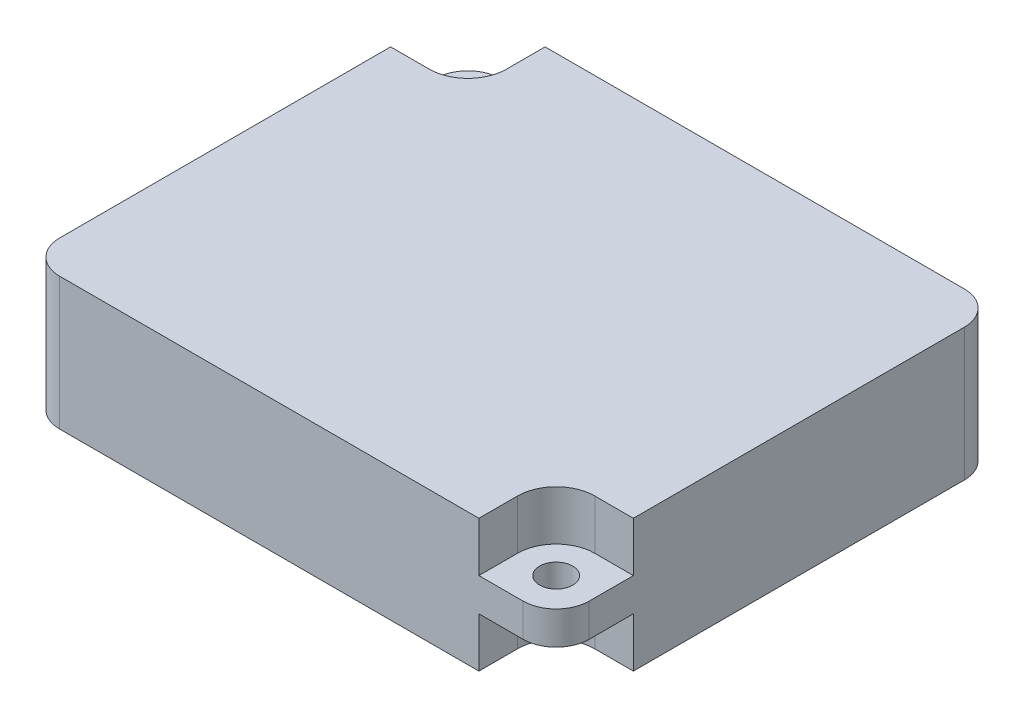
ISO-10303-21;
HEADER;
FILE_DESCRIPTION(('STEP AP214'),'2;1');
FILE_NAME('part.step','',(''),(''),'','','');
FILE_SCHEMA(('AUTOMOTIVE_DESIGN { 1 0 10303 214 1 1 1 1 }'));
ENDSEC;
DATA;
#1=APPLICATION_CONTEXT('core data for automotive mechanical design processes');
#2=APPLICATION_PROTOCOL_DEFINITION('international standard','automotive_design',2000,#1);
#3=PRODUCT_CONTEXT('',#1,'mechanical');
#4=PRODUCT('Part','Part','',(#3));
#5=PRODUCT_RELATED_PRODUCT_CATEGORY('part','',(#4));
#6=PRODUCT_DEFINITION_FORMATION('','',#4);
#7=PRODUCT_DEFINITION_CONTEXT('part definition',#1,'design');
#8=PRODUCT_DEFINITION('design','',#6,#7);
#9=PRODUCT_DEFINITION_SHAPE('','',#8);
#10=(LENGTH_UNIT() NAMED_UNIT(*) SI_UNIT(.MILLI.,.METRE.));
#11=(NAMED_UNIT(*) PLANE_ANGLE_UNIT() SI_UNIT($,.RADIAN.));
#12=(NAMED_UNIT(*) SI_UNIT($,.STERADIAN.) SOLID_ANGLE_UNIT());
#13=UNCERTAINTY_MEASURE_WITH_UNIT(LENGTH_MEASURE(1.E-05),#10,'distance_accuracy_value','');
#14=(GEOMETRIC_REPRESENTATION_CONTEXT(3) GLOBAL_UNCERTAINTY_ASSIGNED_CONTEXT((#13)) GLOBAL_UNIT_ASSIGNED_CONTEXT((#10,
#11,#12)) REPRESENTATION_CONTEXT('',''));
#15=CARTESIAN_POINT('',(0.,0.,0.));
#16=DIRECTION('',(0.,0.,1.));
#17=DIRECTION('',(1.,0.,0.));
#18=AXIS2_PLACEMENT_3D('',#15,#16,#17);
#19=CARTESIAN_POINT('',(-17.,-6.,-16.5));
#20=DIRECTION('',(1.,0.,0.));
#21=DIRECTION('',(0.,0.,-1.));
#22=AXIS2_PLACEMENT_3D('',#19,#20,#21);
#23=PLANE('',#22);
#24=DIRECTION('',(0.,0.,-1.));
#25=VECTOR('',#24,1.);
#26=CARTESIAN_POINT('',(-17.,-1.5,-16.5));
#27=LINE('',#26,#25);
#28=CARTESIAN_POINT('',(-17.,-1.5,-16.5));
#29=VERTEX_POINT('',#28);
#30=CARTESIAN_POINT('',(-17.,-1.5,-20.));
#31=VERTEX_POINT('',#30);
#32=EDGE_CURVE('E235',#29,#31,#27,.T.);
#33=ORIENTED_EDGE('',*,*,#32,.T.);
#34=DIRECTION('',(0.,1.,0.));
#35=VECTOR('',#34,1.);
#36=CARTESIAN_POINT('',(-17.,-6.,-20.));
#37=LINE('',#36,#35);
#38=CARTESIAN_POINT('',(-17.,-6.,-20.));
#39=VERTEX_POINT('',#38);
#40=EDGE_CURVE('E278',#39,#31,#37,.T.);
#41=ORIENTED_EDGE('',*,*,#40,.F.);
#42=DIRECTION('',(0.,0.,-1.));
#43=VECTOR('',#42,1.);
#44=CARTESIAN_POINT('',(-17.,-6.,-16.5));
#45=LINE('',#44,#43);
#46=CARTESIAN_POINT('',(-17.,-6.,-16.5));
#47=VERTEX_POINT('',#46);
#48=EDGE_CURVE('E211',#47,#39,#45,.T.);
#49=ORIENTED_EDGE('',*,*,#48,.F.);
#50=DIRECTION('',(0.,1.,0.));
#51=VECTOR('',#50,1.);
#52=CARTESIAN_POINT('',(-17.,-6.,-16.5));
#53=LINE('',#52,#51);
#54=EDGE_CURVE('E288',#47,#29,#53,.T.);
#55=ORIENTED_EDGE('',*,*,#54,.T.);
#56=EDGE_LOOP('',(#33,#41,#49,#55));
#57=FACE_BOUND('',#56,.T.);
#58=ADVANCED_FACE('F33',(#57),#23,.F.);
#59=CARTESIAN_POINT('',(-20.5,-6.,-16.5));
#60=DIRECTION('',(0.,1.,0.));
#61=DIRECTION('',(0.,0.,1.));
#62=AXIS2_PLACEMENT_3D('',#59,#60,#61);
#63=CYLINDRICAL_SURFACE('',#62,3.5);
#64=CARTESIAN_POINT('',(-20.5,-1.5,-16.5));
#65=DIRECTION('',(0.,1.,0.));
#66=DIRECTION('',(0.,0.,1.));
#67=AXIS2_PLACEMENT_3D('',#64,#65,#66);
#68=CIRCLE('',#67,3.5);
#69=CARTESIAN_POINT('',(-20.5,-1.5,-13.));
#70=VERTEX_POINT('',#69);
#71=EDGE_CURVE('E233',#70,#29,#68,.T.);
#72=ORIENTED_EDGE('',*,*,#71,.T.);
#73=ORIENTED_EDGE('',*,*,#54,.F.);
#74=CARTESIAN_POINT('',(-20.5,-6.,-16.5));
#75=DIRECTION('',(0.,1.,0.));
#76=DIRECTION('',(0.,0.,1.));
#77=AXIS2_PLACEMENT_3D('',#74,#75,#76);
#78=CIRCLE('',#77,3.5);
#79=CARTESIAN_POINT('',(-20.5,-6.,-13.));
#80=VERTEX_POINT('',#79);
#81=EDGE_CURVE('E272',#80,#47,#78,.T.);
#82=ORIENTED_EDGE('',*,*,#81,.F.);
#83=DIRECTION('',(0.,1.,0.));
#84=VECTOR('',#83,1.);
#85=CARTESIAN_POINT('',(-20.5,-6.,-13.));
#86=LINE('',#85,#84);
#87=EDGE_CURVE('E284',#80,#70,#86,.T.);
#88=ORIENTED_EDGE('',*,*,#87,.T.);
#89=EDGE_LOOP('',(#72,#73,#82,#88));
#90=FACE_BOUND('',#89,.T.);
#91=ADVANCED_FACE('F396',(#90),#63,.F.);
#92=CARTESIAN_POINT('',(-24.,-6.,-13.));
#93=DIRECTION('',(0.,0.,1.));
#94=DIRECTION('',(1.,0.,0.));
#95=AXIS2_PLACEMENT_3D('',#92,#93,#94);
#96=PLANE('',#95);
#97=DIRECTION('',(1.,0.,0.));
#98=VECTOR('',#97,1.);
#99=CARTESIAN_POINT('',(-24.,-1.5,-13.));
#100=LINE('',#99,#98);
#101=CARTESIAN_POINT('',(-24.,-1.5,-13.));
#102=VERTEX_POINT('',#101);
#103=EDGE_CURVE('E231',#102,#70,#100,.T.);
#104=ORIENTED_EDGE('',*,*,#103,.T.);
#105=ORIENTED_EDGE('',*,*,#87,.F.);
#106=DIRECTION('',(1.,0.,0.));
#107=VECTOR('',#106,1.);
#108=CARTESIAN_POINT('',(-24.,-6.,-13.));
#109=LINE('',#108,#107);
#110=CARTESIAN_POINT('',(-24.,-6.,-13.));
#111=VERTEX_POINT('',#110);
#112=EDGE_CURVE('E269',#111,#80,#109,.T.);
#113=ORIENTED_EDGE('',*,*,#112,.F.);
#114=DIRECTION('',(0.,1.,0.));
#115=VECTOR('',#114,1.);
#116=CARTESIAN_POINT('',(-24.,-6.,-13.));
#117=LINE('',#116,#115);
#118=EDGE_CURVE('E210',#111,#102,#117,.T.);
#119=ORIENTED_EDGE('',*,*,#118,.T.);
#120=EDGE_LOOP('',(#104,#105,#113,#119));
#121=FACE_BOUND('',#120,.T.);
#122=ADVANCED_FACE('F392',(#121),#96,.F.);
#123=CARTESIAN_POINT('',(20.5,-6.,16.5));
#124=DIRECTION('',(0.,1.,0.));
#125=DIRECTION('',(0.,0.,1.));
#126=AXIS2_PLACEMENT_3D('',#123,#124,#125);
#127=CYLINDRICAL_SURFACE('',#126,3.5);
#128=CARTESIAN_POINT('',(20.5,-1.5,16.5));
#129=DIRECTION('',(0.,1.,0.));
#130=DIRECTION('',(0.,0.,1.));
#131=AXIS2_PLACEMENT_3D('',#128,#129,#130);
#132=CIRCLE('',#131,3.5);
#133=CARTESIAN_POINT('',(20.5,-1.5,13.));
#134=VERTEX_POINT('',#133);
#135=CARTESIAN_POINT('',(17.,-1.5,16.5));
#136=VERTEX_POINT('',#135);
#137=EDGE_CURVE('E261',#134,#136,#132,.T.);
#138=ORIENTED_EDGE('',*,*,#137,.T.);
#139=DIRECTION('',(0.,1.,0.));
#140=VECTOR('',#139,1.);
#141=CARTESIAN_POINT('',(17.,-6.,16.5));
#142=LINE('',#141,#140);
#143=CARTESIAN_POINT('',(17.,-6.,16.5));
#144=VERTEX_POINT('',#143);
#145=EDGE_CURVE('E311',#144,#136,#142,.T.);
#146=ORIENTED_EDGE('',*,*,#145,.F.);
#147=CARTESIAN_POINT('',(20.5,-6.,16.5));
#148=DIRECTION('',(0.,1.,0.));
#149=DIRECTION('',(0.,0.,1.));
#150=AXIS2_PLACEMENT_3D('',#147,#148,#149);
#151=CIRCLE('',#150,3.5);
#152=CARTESIAN_POINT('',(20.5,-6.,13.));
#153=VERTEX_POINT('',#152);
#154=EDGE_CURVE('E256',#153,#144,#151,.T.);
#155=ORIENTED_EDGE('',*,*,#154,.F.);
#156=DIRECTION('',(0.,1.,0.));
#157=VECTOR('',#156,1.);
#158=CARTESIAN_POINT('',(20.5,-6.,13.));
#159=LINE('',#158,#157);
#160=EDGE_CURVE('E273',#153,#134,#159,.T.);
#161=ORIENTED_EDGE('',*,*,#160,.T.);
#162=EDGE_LOOP('',(#138,#146,#155,#161));
#163=FACE_BOUND('',#162,.T.);
#164=ADVANCED_FACE('F450',(#163),#127,.F.);
#165=CARTESIAN_POINT('',(24.,-6.,13.));
#166=DIRECTION('',(0.,0.,-1.));
#167=DIRECTION('',(-1.,0.,0.));
#168=AXIS2_PLACEMENT_3D('',#165,#166,#167);
#169=PLANE('',#168);
#170=DIRECTION('',(-1.,0.,0.));
#171=VECTOR('',#170,1.);
#172=CARTESIAN_POINT('',(24.,-1.5,13.));
#173=LINE('',#172,#171);
#174=CARTESIAN_POINT('',(24.,-1.5,13.));
#175=VERTEX_POINT('',#174);
#176=EDGE_CURVE('E258',#175,#134,#173,.T.);
#177=ORIENTED_EDGE('',*,*,#176,.T.);
#178=ORIENTED_EDGE('',*,*,#160,.F.);
#179=DIRECTION('',(-1.,0.,0.));
#180=VECTOR('',#179,1.);
#181=CARTESIAN_POINT('',(24.,-6.,13.));
#182=LINE('',#181,#180);
#183=CARTESIAN_POINT('',(24.,-6.,13.));
#184=VERTEX_POINT('',#183);
#185=EDGE_CURVE('E296',#184,#153,#182,.T.);
#186=ORIENTED_EDGE('',*,*,#185,.F.);
#187=DIRECTION('',(0.,1.,0.));
#188=VECTOR('',#187,1.);
#189=CARTESIAN_POINT('',(24.,-6.,13.));
#190=LINE('',#189,#188);
#191=EDGE_CURVE('E300',#184,#175,#190,.T.);
#192=ORIENTED_EDGE('',*,*,#191,.T.);
#193=EDGE_LOOP('',(#177,#178,#186,#192));
#194=FACE_BOUND('',#193,.T.);
#195=ADVANCED_FACE('F446',(#194),#169,.F.);
#196=CARTESIAN_POINT('',(17.,-6.,16.5));
#197=DIRECTION('',(-1.,0.,0.));
#198=DIRECTION('',(0.,0.,1.));
#199=AXIS2_PLACEMENT_3D('',#196,#197,#198);
#200=PLANE('',#199);
#201=DIRECTION('',(0.,0.,1.));
#202=VECTOR('',#201,1.);
#203=CARTESIAN_POINT('',(17.,-1.5,16.5));
#204=LINE('',#203,#202);
#205=CARTESIAN_POINT('',(17.,-1.5,20.));
#206=VERTEX_POINT('',#205);
#207=EDGE_CURVE('E264',#136,#206,#204,.T.);
#208=ORIENTED_EDGE('',*,*,#207,.T.);
#209=DIRECTION('',(0.,1.,0.));
#210=VECTOR('',#209,1.);
#211=CARTESIAN_POINT('',(17.,-6.,20.));
#212=LINE('',#211,#210);
#213=CARTESIAN_POINT('',(17.,-6.,20.));
#214=VERTEX_POINT('',#213);
#215=EDGE_CURVE('E305',#214,#206,#212,.T.);
#216=ORIENTED_EDGE('',*,*,#215,.F.);
#217=DIRECTION('',(0.,0.,1.));
#218=VECTOR('',#217,1.);
#219=CARTESIAN_POINT('',(17.,-6.,16.5));
#220=LINE('',#219,#218);
#221=EDGE_CURVE('E293',#144,#214,#220,.T.);
#222=ORIENTED_EDGE('',*,*,#221,.F.);
#223=ORIENTED_EDGE('',*,*,#145,.T.);
#224=EDGE_LOOP('',(#208,#216,#222,#223));
#225=FACE_BOUND('',#224,.T.);
#226=ADVANCED_FACE('F453',(#225),#200,.F.);
#227=CARTESIAN_POINT('',(24.,6.,-20.));
#228=DIRECTION('',(-1.,0.,0.));
#229=DIRECTION('',(0.,0.,1.));
#230=AXIS2_PLACEMENT_3D('',#227,#228,#229);
#231=PLANE('',#230);
#232=DIRECTION('',(0.,0.,-1.));
#233=VECTOR('',#232,1.);
#234=CARTESIAN_POINT('',(24.,1.5,20.));
#235=LINE('',#234,#233);
#236=CARTESIAN_POINT('',(24.,1.5,17.));
#237=VERTEX_POINT('',#236);
#238=CARTESIAN_POINT('',(24.,1.5,13.));
#239=VERTEX_POINT('',#238);
#240=EDGE_CURVE('E243',#237,#239,#235,.T.);
#241=ORIENTED_EDGE('',*,*,#240,.F.);
#242=DIRECTION('',(0.,-1.,0.));
#243=VECTOR('',#242,1.);
#244=CARTESIAN_POINT('',(24.,6.,17.));
#245=LINE('',#244,#243);
#246=CARTESIAN_POINT('',(24.,-1.5,17.));
#247=VERTEX_POINT('',#246);
#248=EDGE_CURVE('E349',#237,#247,#245,.T.);
#249=ORIENTED_EDGE('',*,*,#248,.T.);
#250=DIRECTION('',(0.,0.,-1.));
#251=VECTOR('',#250,1.);
#252=CARTESIAN_POINT('',(24.,-1.5,20.));
#253=LINE('',#252,#251);
#254=EDGE_CURVE('E240',#247,#175,#253,.T.);
#255=ORIENTED_EDGE('',*,*,#254,.T.);
#256=ORIENTED_EDGE('',*,*,#191,.F.);
#257=DIRECTION('',(0.,0.,-1.));
#258=VECTOR('',#257,1.);
#259=CARTESIAN_POINT('',(24.,-6.,-20.));
#260=LINE('',#259,#258);
#261=CARTESIAN_POINT('',(24.,-6.,-17.));
#262=VERTEX_POINT('',#261);
#263=EDGE_CURVE('E326',#184,#262,#260,.T.);
#264=ORIENTED_EDGE('',*,*,#263,.T.);
#265=DIRECTION('',(0.,-1.,0.));
#266=VECTOR('',#265,1.);
#267=CARTESIAN_POINT('',(24.,6.,-17.));
#268=LINE('',#267,#266);
#269=CARTESIAN_POINT('',(24.,6.,-17.));
#270=VERTEX_POINT('',#269);
#271=EDGE_CURVE('E336',#262,#270,#268,.F.);
#272=ORIENTED_EDGE('',*,*,#271,.T.);
#273=DIRECTION('',(0.,0.,-1.));
#274=VECTOR('',#273,1.);
#275=CARTESIAN_POINT('',(24.,6.,-20.));
#276=LINE('',#275,#274);
#277=CARTESIAN_POINT('',(24.,6.,13.));
#278=VERTEX_POINT('',#277);
#279=EDGE_CURVE('E327',#278,#270,#276,.T.);
#280=ORIENTED_EDGE('',*,*,#279,.F.);
#281=EDGE_CURVE('E304',#239,#278,#190,.T.);
#282=ORIENTED_EDGE('',*,*,#281,.F.);
#283=EDGE_LOOP('',(#241,#249,#255,#256,#264,#272,#280,#282));
#284=FACE_BOUND('',#283,.T.);
#285=ADVANCED_FACE('F433',(#284),#231,.F.);
#286=CARTESIAN_POINT('',(-24.,6.,-20.));
#287=DIRECTION('',(0.,0.,1.));
#288=DIRECTION('',(1.,0.,0.));
#289=AXIS2_PLACEMENT_3D('',#286,#287,#288);
#290=PLANE('',#289);
#291=DIRECTION('',(-1.,0.,0.));
#292=VECTOR('',#291,1.);
#293=CARTESIAN_POINT('',(-24.,6.,-20.));
#294=LINE('',#293,#292);
#295=CARTESIAN_POINT('',(21.,6.,-20.));
#296=VERTEX_POINT('',#295);
#297=CARTESIAN_POINT('',(-17.,6.,-20.));
#298=VERTEX_POINT('',#297);
#299=EDGE_CURVE('E330',#296,#298,#294,.T.);
#300=ORIENTED_EDGE('',*,*,#299,.F.);
#301=DIRECTION('',(0.,-1.,0.));
#302=VECTOR('',#301,1.);
#303=CARTESIAN_POINT('',(21.,6.,-20.));
#304=LINE('',#303,#302);
#305=CARTESIAN_POINT('',(21.,-6.,-20.));
#306=VERTEX_POINT('',#305);
#307=EDGE_CURVE('E363',#296,#306,#304,.T.);
#308=ORIENTED_EDGE('',*,*,#307,.T.);
#309=DIRECTION('',(-1.,0.,0.));
#310=VECTOR('',#309,1.);
#311=CARTESIAN_POINT('',(-24.,-6.,-20.));
#312=LINE('',#311,#310);
#313=EDGE_CURVE('E339',#306,#39,#312,.T.);
#314=ORIENTED_EDGE('',*,*,#313,.T.);
#315=ORIENTED_EDGE('',*,*,#40,.T.);
#316=DIRECTION('',(-1.,0.,0.));
#317=VECTOR('',#316,1.);
#318=CARTESIAN_POINT('',(-24.,-1.5,-20.));
#319=LINE('',#318,#317);
#320=CARTESIAN_POINT('',(-21.,-1.5,-20.));
#321=VERTEX_POINT('',#320);
#322=EDGE_CURVE('E225',#31,#321,#319,.T.);
#323=ORIENTED_EDGE('',*,*,#322,.T.);
#324=DIRECTION('',(0.,-1.,0.));
#325=VECTOR('',#324,1.);
#326=CARTESIAN_POINT('',(-21.,6.,-20.));
#327=LINE('',#326,#325);
#328=CARTESIAN_POINT('',(-21.,1.5,-20.));
#329=VERTEX_POINT('',#328);
#330=EDGE_CURVE('E361',#321,#329,#327,.F.);
#331=ORIENTED_EDGE('',*,*,#330,.T.);
#332=DIRECTION('',(-1.,0.,0.));
#333=VECTOR('',#332,1.);
#334=CARTESIAN_POINT('',(-24.,1.5,-20.));
#335=LINE('',#334,#333);
#336=CARTESIAN_POINT('',(-17.,1.5,-20.));
#337=VERTEX_POINT('',#336);
#338=EDGE_CURVE('E199',#337,#329,#335,.T.);
#339=ORIENTED_EDGE('',*,*,#338,.F.);
#340=EDGE_CURVE('E281',#337,#298,#37,.T.);
#341=ORIENTED_EDGE('',*,*,#340,.T.);
#342=EDGE_LOOP('',(#300,#308,#314,#315,#323,#331,#339,#341));
#343=FACE_BOUND('',#342,.T.);
#344=ADVANCED_FACE('F386',(#343),#290,.F.);
#345=CARTESIAN_POINT('',(-24.,6.,-20.));
#346=DIRECTION('',(1.,0.,0.));
#347=DIRECTION('',(0.,0.,-1.));
#348=AXIS2_PLACEMENT_3D('',#345,#346,#347);
#349=PLANE('',#348);
#350=DIRECTION('',(0.,0.,1.));
#351=VECTOR('',#350,1.);
#352=CARTESIAN_POINT('',(-24.,-6.,-20.));
#353=LINE('',#352,#351);
#354=CARTESIAN_POINT('',(-24.,-6.,17.));
#355=VERTEX_POINT('',#354);
#356=EDGE_CURVE('E341',#111,#355,#353,.T.);
#357=ORIENTED_EDGE('',*,*,#356,.T.);
#358=DIRECTION('',(0.,-1.,0.));
#359=VECTOR('',#358,1.);
#360=CARTESIAN_POINT('',(-24.,6.,17.));
#361=LINE('',#360,#359);
#362=CARTESIAN_POINT('',(-24.,6.,17.));
#363=VERTEX_POINT('',#362);
#364=EDGE_CURVE('E376',#355,#363,#361,.F.);
#365=ORIENTED_EDGE('',*,*,#364,.T.);
#366=DIRECTION('',(0.,0.,1.));
#367=VECTOR('',#366,1.);
#368=CARTESIAN_POINT('',(-24.,6.,-20.));
#369=LINE('',#368,#367);
#370=CARTESIAN_POINT('',(-24.,6.,-13.));
#371=VERTEX_POINT('',#370);
#372=EDGE_CURVE('E206',#371,#363,#369,.T.);
#373=ORIENTED_EDGE('',*,*,#372,.F.);
#374=CARTESIAN_POINT('',(-24.,1.5,-13.));
#375=VERTEX_POINT('',#374);
#376=EDGE_CURVE('E202',#375,#371,#117,.T.);
#377=ORIENTED_EDGE('',*,*,#376,.F.);
#378=DIRECTION('',(0.,0.,1.));
#379=VECTOR('',#378,1.);
#380=CARTESIAN_POINT('',(-24.,1.5,-13.));
#381=LINE('',#380,#379);
#382=CARTESIAN_POINT('',(-24.,1.5,-17.));
#383=VERTEX_POINT('',#382);
#384=EDGE_CURVE('E191',#383,#375,#381,.T.);
#385=ORIENTED_EDGE('',*,*,#384,.F.);
#386=DIRECTION('',(0.,-1.,0.));
#387=VECTOR('',#386,1.);
#388=CARTESIAN_POINT('',(-24.,6.,-17.));
#389=LINE('',#388,#387);
#390=CARTESIAN_POINT('',(-24.,-1.5,-17.));
#391=VERTEX_POINT('',#390);
#392=EDGE_CURVE('E374',#383,#391,#389,.T.);
#393=ORIENTED_EDGE('',*,*,#392,.T.);
#394=DIRECTION('',(0.,0.,1.));
#395=VECTOR('',#394,1.);
#396=CARTESIAN_POINT('',(-24.,-1.5,-13.));
#397=LINE('',#396,#395);
#398=EDGE_CURVE('E228',#391,#102,#397,.T.);
#399=ORIENTED_EDGE('',*,*,#398,.T.);
#400=ORIENTED_EDGE('',*,*,#118,.F.);
#401=EDGE_LOOP('',(#357,#365,#373,#377,#385,#393,#399,#400));
#402=FACE_BOUND('',#401,.T.);
#403=ADVANCED_FACE('F204',(#402),#349,.F.);
#404=CARTESIAN_POINT('',(-24.,6.,20.));
#405=DIRECTION('',(0.,0.,-1.));
#406=DIRECTION('',(-1.,0.,0.));
#407=AXIS2_PLACEMENT_3D('',#404,#405,#406);
#408=PLANE('',#407);
#409=DIRECTION('',(1.,0.,0.));
#410=VECTOR('',#409,1.);
#411=CARTESIAN_POINT('',(17.,-1.5,20.));
#412=LINE('',#411,#410);
#413=CARTESIAN_POINT('',(21.,-1.5,20.));
#414=VERTEX_POINT('',#413);
#415=EDGE_CURVE('E246',#206,#414,#412,.T.);
#416=ORIENTED_EDGE('',*,*,#415,.T.);
#417=DIRECTION('',(0.,-1.,0.));
#418=VECTOR('',#417,1.);
#419=CARTESIAN_POINT('',(21.,6.,20.));
#420=LINE('',#419,#418);
#421=CARTESIAN_POINT('',(21.,1.5,20.));
#422=VERTEX_POINT('',#421);
#423=EDGE_CURVE('E357',#414,#422,#420,.F.);
#424=ORIENTED_EDGE('',*,*,#423,.T.);
#425=DIRECTION('',(1.,0.,0.));
#426=VECTOR('',#425,1.);
#427=CARTESIAN_POINT('',(17.,1.5,20.));
#428=LINE('',#427,#426);
#429=CARTESIAN_POINT('',(17.,1.5,20.));
#430=VERTEX_POINT('',#429);
#431=EDGE_CURVE('E253',#430,#422,#428,.T.);
#432=ORIENTED_EDGE('',*,*,#431,.F.);
#433=CARTESIAN_POINT('',(17.,6.,20.));
#434=VERTEX_POINT('',#433);
#435=EDGE_CURVE('E308',#430,#434,#212,.T.);
#436=ORIENTED_EDGE('',*,*,#435,.T.);
#437=DIRECTION('',(1.,0.,0.));
#438=VECTOR('',#437,1.);
#439=CARTESIAN_POINT('',(-24.,6.,20.));
#440=LINE('',#439,#438);
#441=CARTESIAN_POINT('',(-21.,6.,20.));
#442=VERTEX_POINT('',#441);
#443=EDGE_CURVE('E334',#442,#434,#440,.T.);
#444=ORIENTED_EDGE('',*,*,#443,.F.);
#445=DIRECTION('',(0.,-1.,0.));
#446=VECTOR('',#445,1.);
#447=CARTESIAN_POINT('',(-21.,6.,20.));
#448=LINE('',#447,#446);
#449=CARTESIAN_POINT('',(-21.,-6.,20.));
#450=VERTEX_POINT('',#449);
#451=EDGE_CURVE('E354',#442,#450,#448,.T.);
#452=ORIENTED_EDGE('',*,*,#451,.T.);
#453=DIRECTION('',(1.,0.,0.));
#454=VECTOR('',#453,1.);
#455=CARTESIAN_POINT('',(-24.,-6.,20.));
#456=LINE('',#455,#454);
#457=EDGE_CURVE('E331',#450,#214,#456,.T.);
#458=ORIENTED_EDGE('',*,*,#457,.T.);
#459=ORIENTED_EDGE('',*,*,#215,.T.);
#460=EDGE_LOOP('',(#416,#424,#432,#436,#444,#452,#458,#459));
#461=FACE_BOUND('',#460,.T.);
#462=ADVANCED_FACE('F414',(#461),#408,.F.);
#463=CARTESIAN_POINT('',(0.,6.,0.));
#464=DIRECTION('',(0.,1.,0.));
#465=DIRECTION('',(0.,0.,1.));
#466=AXIS2_PLACEMENT_3D('',#463,#464,#465);
#467=PLANE('',#466);
#468=ORIENTED_EDGE('',*,*,#279,.T.);
#469=CARTESIAN_POINT('',(21.,6.,-17.));
#470=DIRECTION('',(0.,1.,0.));
#471=DIRECTION('',(0.,0.,1.));
#472=AXIS2_PLACEMENT_3D('',#469,#470,#471);
#473=CIRCLE('',#472,3.);
#474=EDGE_CURVE('E372',#270,#296,#473,.T.);
#475=ORIENTED_EDGE('',*,*,#474,.T.);
#476=ORIENTED_EDGE('',*,*,#299,.T.);
#477=DIRECTION('',(0.,0.,-1.));
#478=VECTOR('',#477,1.);
#479=CARTESIAN_POINT('',(-17.,6.,0.));
#480=LINE('',#479,#478);
#481=CARTESIAN_POINT('',(-17.,6.,-16.5));
#482=VERTEX_POINT('',#481);
#483=EDGE_CURVE('E323',#482,#298,#480,.T.);
#484=ORIENTED_EDGE('',*,*,#483,.F.);
#485=CARTESIAN_POINT('',(-20.5,6.,-16.5));
#486=DIRECTION('',(0.,1.,0.));
#487=DIRECTION('',(0.,0.,1.));
#488=AXIS2_PLACEMENT_3D('',#485,#486,#487);
#489=CIRCLE('',#488,3.5);
#490=CARTESIAN_POINT('',(-20.5,6.,-13.));
#491=VERTEX_POINT('',#490);
#492=EDGE_CURVE('E322',#491,#482,#489,.T.);
#493=ORIENTED_EDGE('',*,*,#492,.F.);
#494=DIRECTION('',(1.,0.,0.));
#495=VECTOR('',#494,1.);
#496=CARTESIAN_POINT('',(0.,6.,-13.));
#497=LINE('',#496,#495);
#498=EDGE_CURVE('E320',#371,#491,#497,.T.);
#499=ORIENTED_EDGE('',*,*,#498,.F.);
#500=ORIENTED_EDGE('',*,*,#372,.T.);
#501=CARTESIAN_POINT('',(-21.,6.,17.));
#502=DIRECTION('',(0.,1.,0.));
#503=DIRECTION('',(0.,0.,1.));
#504=AXIS2_PLACEMENT_3D('',#501,#502,#503);
#505=CIRCLE('',#504,3.);
#506=EDGE_CURVE('E370',#363,#442,#505,.T.);
#507=ORIENTED_EDGE('',*,*,#506,.T.);
#508=ORIENTED_EDGE('',*,*,#443,.T.);
#509=DIRECTION('',(0.,0.,1.));
#510=VECTOR('',#509,1.);
#511=CARTESIAN_POINT('',(17.,6.,0.));
#512=LINE('',#511,#510);
#513=CARTESIAN_POINT('',(17.,6.,16.5));
#514=VERTEX_POINT('',#513);
#515=EDGE_CURVE('E280',#514,#434,#512,.T.);
#516=ORIENTED_EDGE('',*,*,#515,.F.);
#517=CARTESIAN_POINT('',(20.5,6.,16.5));
#518=DIRECTION('',(0.,1.,0.));
#519=DIRECTION('',(0.,0.,1.));
#520=AXIS2_PLACEMENT_3D('',#517,#518,#519);
#521=CIRCLE('',#520,3.5);
#522=CARTESIAN_POINT('',(20.5,6.,13.));
#523=VERTEX_POINT('',#522);
#524=EDGE_CURVE('E319',#523,#514,#521,.T.);
#525=ORIENTED_EDGE('',*,*,#524,.F.);
#526=DIRECTION('',(-1.,0.,0.));
#527=VECTOR('',#526,1.);
#528=CARTESIAN_POINT('',(0.,6.,13.));
#529=LINE('',#528,#527);
#530=EDGE_CURVE('E316',#278,#523,#529,.T.);
#531=ORIENTED_EDGE('',*,*,#530,.F.);
#532=EDGE_LOOP('',(#468,#475,#476,#484,#493,#499,#500,#507,#508,#516,#525,#531));
#533=FACE_BOUND('',#532,.T.);
#534=ADVANCED_FACE('F410',(#533),#467,.T.);
#535=CARTESIAN_POINT('',(0.,-6.,0.));
#536=DIRECTION('',(0.,1.,0.));
#537=DIRECTION('',(0.,0.,1.));
#538=AXIS2_PLACEMENT_3D('',#535,#536,#537);
#539=PLANE('',#538);
#540=ORIENTED_EDGE('',*,*,#313,.F.);
#541=CARTESIAN_POINT('',(21.,-6.,-17.));
#542=DIRECTION('',(0.,1.,0.));
#543=DIRECTION('',(0.,0.,1.));
#544=AXIS2_PLACEMENT_3D('',#541,#542,#543);
#545=CIRCLE('',#544,3.);
#546=EDGE_CURVE('E368',#306,#262,#545,.F.);
#547=ORIENTED_EDGE('',*,*,#546,.T.);
#548=ORIENTED_EDGE('',*,*,#263,.F.);
#549=ORIENTED_EDGE('',*,*,#185,.T.);
#550=ORIENTED_EDGE('',*,*,#154,.T.);
#551=ORIENTED_EDGE('',*,*,#221,.T.);
#552=ORIENTED_EDGE('',*,*,#457,.F.);
#553=CARTESIAN_POINT('',(-21.,-6.,17.));
#554=DIRECTION('',(0.,1.,0.));
#555=DIRECTION('',(0.,0.,1.));
#556=AXIS2_PLACEMENT_3D('',#553,#554,#555);
#557=CIRCLE('',#556,3.);
#558=EDGE_CURVE('E366',#450,#355,#557,.F.);
#559=ORIENTED_EDGE('',*,*,#558,.T.);
#560=ORIENTED_EDGE('',*,*,#356,.F.);
#561=ORIENTED_EDGE('',*,*,#112,.T.);
#562=ORIENTED_EDGE('',*,*,#81,.T.);
#563=ORIENTED_EDGE('',*,*,#48,.T.);
#564=EDGE_LOOP('',(#540,#547,#548,#549,#550,#551,#552,#559,#560,#561,#562,#563));
#565=FACE_BOUND('',#564,.T.);
#566=ADVANCED_FACE('F401',(#565),#539,.F.);
#567=CARTESIAN_POINT('',(17.,1.5,16.5));
#568=VERTEX_POINT('',#567);
#569=EDGE_CURVE('E299',#568,#514,#142,.T.);
#570=ORIENTED_EDGE('',*,*,#569,.F.);
#571=CARTESIAN_POINT('',(20.5,1.5,16.5));
#572=DIRECTION('',(0.,1.,0.));
#573=DIRECTION('',(0.,0.,1.));
#574=AXIS2_PLACEMENT_3D('',#571,#572,#573);
#575=CIRCLE('',#574,3.5);
#576=CARTESIAN_POINT('',(20.5,1.5,13.));
#577=VERTEX_POINT('',#576);
#578=EDGE_CURVE('E248',#577,#568,#575,.T.);
#579=ORIENTED_EDGE('',*,*,#578,.F.);
#580=EDGE_CURVE('E303',#577,#523,#159,.T.);
#581=ORIENTED_EDGE('',*,*,#580,.T.);
#582=ORIENTED_EDGE('',*,*,#524,.T.);
#583=EDGE_LOOP('',(#570,#579,#581,#582));
#584=FACE_BOUND('',#583,.T.);
#585=ADVANCED_FACE('F424',(#584),#127,.F.);
#586=ORIENTED_EDGE('',*,*,#580,.F.);
#587=DIRECTION('',(-1.,0.,0.));
#588=VECTOR('',#587,1.);
#589=CARTESIAN_POINT('',(24.,1.5,13.));
#590=LINE('',#589,#588);
#591=EDGE_CURVE('E245',#239,#577,#590,.T.);
#592=ORIENTED_EDGE('',*,*,#591,.F.);
#593=ORIENTED_EDGE('',*,*,#281,.T.);
#594=ORIENTED_EDGE('',*,*,#530,.T.);
#595=EDGE_LOOP('',(#586,#592,#593,#594));
#596=FACE_BOUND('',#595,.T.);
#597=ADVANCED_FACE('F429',(#596),#169,.F.);
#598=ORIENTED_EDGE('',*,*,#435,.F.);
#599=DIRECTION('',(0.,0.,1.));
#600=VECTOR('',#599,1.);
#601=CARTESIAN_POINT('',(17.,1.5,16.5));
#602=LINE('',#601,#600);
#603=EDGE_CURVE('E250',#568,#430,#602,.T.);
#604=ORIENTED_EDGE('',*,*,#603,.F.);
#605=ORIENTED_EDGE('',*,*,#569,.T.);
#606=ORIENTED_EDGE('',*,*,#515,.T.);
#607=EDGE_LOOP('',(#598,#604,#605,#606));
#608=FACE_BOUND('',#607,.T.);
#609=ADVANCED_FACE('F418',(#608),#200,.F.);
#610=ORIENTED_EDGE('',*,*,#340,.F.);
#611=DIRECTION('',(0.,0.,-1.));
#612=VECTOR('',#611,1.);
#613=CARTESIAN_POINT('',(-17.,1.5,-16.5));
#614=LINE('',#613,#612);
#615=CARTESIAN_POINT('',(-17.,1.5,-16.5));
#616=VERTEX_POINT('',#615);
#617=EDGE_CURVE('E218',#616,#337,#614,.T.);
#618=ORIENTED_EDGE('',*,*,#617,.F.);
#619=EDGE_CURVE('E287',#616,#482,#53,.T.);
#620=ORIENTED_EDGE('',*,*,#619,.T.);
#621=ORIENTED_EDGE('',*,*,#483,.T.);
#622=EDGE_LOOP('',(#610,#618,#620,#621));
#623=FACE_BOUND('',#622,.T.);
#624=ADVANCED_FACE('F479',(#623),#23,.F.);
#625=ORIENTED_EDGE('',*,*,#619,.F.);
#626=CARTESIAN_POINT('',(-20.5,1.5,-16.5));
#627=DIRECTION('',(0.,1.,0.));
#628=DIRECTION('',(0.,0.,1.));
#629=AXIS2_PLACEMENT_3D('',#626,#627,#628);
#630=CIRCLE('',#629,3.5);
#631=CARTESIAN_POINT('',(-20.5,1.5,-13.));
#632=VERTEX_POINT('',#631);
#633=EDGE_CURVE('E216',#632,#616,#630,.T.);
#634=ORIENTED_EDGE('',*,*,#633,.F.);
#635=EDGE_CURVE('E215',#632,#491,#86,.T.);
#636=ORIENTED_EDGE('',*,*,#635,.T.);
#637=ORIENTED_EDGE('',*,*,#492,.T.);
#638=EDGE_LOOP('',(#625,#634,#636,#637));
#639=FACE_BOUND('',#638,.T.);
#640=ADVANCED_FACE('F484',(#639),#63,.F.);
#641=ORIENTED_EDGE('',*,*,#635,.F.);
#642=DIRECTION('',(1.,0.,0.));
#643=VECTOR('',#642,1.);
#644=CARTESIAN_POINT('',(-24.,1.5,-13.));
#645=LINE('',#644,#643);
#646=EDGE_CURVE('E197',#375,#632,#645,.T.);
#647=ORIENTED_EDGE('',*,*,#646,.F.);
#648=ORIENTED_EDGE('',*,*,#376,.T.);
#649=ORIENTED_EDGE('',*,*,#498,.T.);
#650=EDGE_LOOP('',(#641,#647,#648,#649));
#651=FACE_BOUND('',#650,.T.);
#652=ADVANCED_FACE('F214',(#651),#96,.F.);
#653=CARTESIAN_POINT('',(20.5,1.5,16.5));
#654=DIRECTION('',(0.,1.,0.));
#655=DIRECTION('',(0.,0.,1.));
#656=AXIS2_PLACEMENT_3D('',#653,#654,#655);
#657=PLANE('',#656);
#658=ORIENTED_EDGE('',*,*,#431,.T.);
#659=CARTESIAN_POINT('',(21.,1.5,17.));
#660=DIRECTION('',(0.,1.,0.));
#661=DIRECTION('',(0.,0.,1.));
#662=AXIS2_PLACEMENT_3D('',#659,#660,#661);
#663=CIRCLE('',#662,3.);
#664=EDGE_CURVE('E359',#422,#237,#663,.T.);
#665=ORIENTED_EDGE('',*,*,#664,.T.);
#666=ORIENTED_EDGE('',*,*,#240,.T.);
#667=ORIENTED_EDGE('',*,*,#591,.T.);
#668=ORIENTED_EDGE('',*,*,#578,.T.);
#669=ORIENTED_EDGE('',*,*,#603,.T.);
#670=EDGE_LOOP('',(#658,#665,#666,#667,#668,#669));
#671=FACE_BOUND('',#670,.T.);
#672=CARTESIAN_POINT('',(20.5,1.5,16.5));
#673=DIRECTION('',(0.,1.,0.));
#674=DIRECTION('',(0.,0.,1.));
#675=AXIS2_PLACEMENT_3D('',#672,#673,#674);
#676=CIRCLE('',#675,1.5);
#677=CARTESIAN_POINT('',(20.5,1.5,18.));
#678=VERTEX_POINT('',#677);
#679=EDGE_CURVE('E237',#678,#678,#676,.T.);
#680=ORIENTED_EDGE('',*,*,#679,.F.);
#681=EDGE_LOOP('',(#680));
#682=FACE_BOUND('',#681,.T.);
#683=ADVANCED_FACE('F460',(#671,#682),#657,.T.);
#684=CARTESIAN_POINT('',(20.5,-1.5,16.5));
#685=DIRECTION('',(0.,1.,0.));
#686=DIRECTION('',(0.,0.,1.));
#687=AXIS2_PLACEMENT_3D('',#684,#685,#686);
#688=PLANE('',#687);
#689=ORIENTED_EDGE('',*,*,#254,.F.);
#690=CARTESIAN_POINT('',(21.,-1.5,17.));
#691=DIRECTION('',(0.,1.,0.));
#692=DIRECTION('',(0.,0.,1.));
#693=AXIS2_PLACEMENT_3D('',#690,#691,#692);
#694=CIRCLE('',#693,3.);
#695=EDGE_CURVE('E352',#247,#414,#694,.F.);
#696=ORIENTED_EDGE('',*,*,#695,.T.);
#697=ORIENTED_EDGE('',*,*,#415,.F.);
#698=ORIENTED_EDGE('',*,*,#207,.F.);
#699=ORIENTED_EDGE('',*,*,#137,.F.);
#700=ORIENTED_EDGE('',*,*,#176,.F.);
#701=EDGE_LOOP('',(#689,#696,#697,#698,#699,#700));
#702=FACE_BOUND('',#701,.T.);
#703=CARTESIAN_POINT('',(20.5,-1.5,16.5));
#704=DIRECTION('',(0.,1.,0.));
#705=DIRECTION('',(0.,0.,1.));
#706=AXIS2_PLACEMENT_3D('',#703,#704,#705);
#707=CIRCLE('',#706,1.5);
#708=CARTESIAN_POINT('',(20.5,-1.5,18.));
#709=VERTEX_POINT('',#708);
#710=EDGE_CURVE('E224',#709,#709,#707,.T.);
#711=ORIENTED_EDGE('',*,*,#710,.T.);
#712=EDGE_LOOP('',(#711));
#713=FACE_BOUND('',#712,.T.);
#714=ADVANCED_FACE('F463',(#702,#713),#688,.F.);
#715=CARTESIAN_POINT('',(20.5,1.5,16.5));
#716=DIRECTION('',(0.,-1.,0.));
#717=DIRECTION('',(0.,0.,-1.));
#718=AXIS2_PLACEMENT_3D('',#715,#716,#717);
#719=CYLINDRICAL_SURFACE('',#718,1.5);
#720=ORIENTED_EDGE('',*,*,#679,.T.);
#721=EDGE_LOOP('',(#720));
#722=FACE_BOUND('',#721,.T.);
#723=ORIENTED_EDGE('',*,*,#710,.F.);
#724=EDGE_LOOP('',(#723));
#725=FACE_BOUND('',#724,.T.);
#726=ADVANCED_FACE('F467',(#722,#725),#719,.F.);
#727=CARTESIAN_POINT('',(-20.5,1.5,-16.5));
#728=DIRECTION('',(0.,1.,0.));
#729=DIRECTION('',(0.,0.,1.));
#730=AXIS2_PLACEMENT_3D('',#727,#728,#729);
#731=PLANE('',#730);
#732=ORIENTED_EDGE('',*,*,#338,.T.);
#733=CARTESIAN_POINT('',(-21.,1.5,-17.));
#734=DIRECTION('',(0.,1.,0.));
#735=DIRECTION('',(0.,0.,1.));
#736=AXIS2_PLACEMENT_3D('',#733,#734,#735);
#737=CIRCLE('',#736,3.);
#738=EDGE_CURVE('E11',#329,#383,#737,.T.);
#739=ORIENTED_EDGE('',*,*,#738,.T.);
#740=ORIENTED_EDGE('',*,*,#384,.T.);
#741=ORIENTED_EDGE('',*,*,#646,.T.);
#742=ORIENTED_EDGE('',*,*,#633,.T.);
#743=ORIENTED_EDGE('',*,*,#617,.T.);
#744=EDGE_LOOP('',(#732,#739,#740,#741,#742,#743));
#745=FACE_BOUND('',#744,.T.);
#746=CARTESIAN_POINT('',(-20.5,1.5,-16.5));
#747=DIRECTION('',(0.,1.,0.));
#748=DIRECTION('',(0.,0.,1.));
#749=AXIS2_PLACEMENT_3D('',#746,#747,#748);
#750=CIRCLE('',#749,1.5);
#751=CARTESIAN_POINT('',(-20.5,1.5,-15.));
#752=VERTEX_POINT('',#751);
#753=EDGE_CURVE('E229',#752,#752,#750,.T.);
#754=ORIENTED_EDGE('',*,*,#753,.F.);
#755=EDGE_LOOP('',(#754));
#756=FACE_BOUND('',#755,.T.);
#757=ADVANCED_FACE('F193',(#745,#756),#731,.T.);
#758=CARTESIAN_POINT('',(-20.5,-1.5,-16.5));
#759=DIRECTION('',(0.,1.,0.));
#760=DIRECTION('',(0.,0.,1.));
#761=AXIS2_PLACEMENT_3D('',#758,#759,#760);
#762=PLANE('',#761);
#763=ORIENTED_EDGE('',*,*,#398,.F.);
#764=CARTESIAN_POINT('',(-21.,-1.5,-17.));
#765=DIRECTION('',(0.,1.,0.));
#766=DIRECTION('',(0.,0.,1.));
#767=AXIS2_PLACEMENT_3D('',#764,#765,#766);
#768=CIRCLE('',#767,3.);
#769=EDGE_CURVE('E41',#391,#321,#768,.F.);
#770=ORIENTED_EDGE('',*,*,#769,.T.);
#771=ORIENTED_EDGE('',*,*,#322,.F.);
#772=ORIENTED_EDGE('',*,*,#32,.F.);
#773=ORIENTED_EDGE('',*,*,#71,.F.);
#774=ORIENTED_EDGE('',*,*,#103,.F.);
#775=EDGE_LOOP('',(#763,#770,#771,#772,#773,#774));
#776=FACE_BOUND('',#775,.T.);
#777=CARTESIAN_POINT('',(-20.5,-1.5,-16.5));
#778=DIRECTION('',(0.,1.,0.));
#779=DIRECTION('',(0.,0.,1.));
#780=AXIS2_PLACEMENT_3D('',#777,#778,#779);
#781=CIRCLE('',#780,1.5);
#782=CARTESIAN_POINT('',(-20.5,-1.5,-15.));
#783=VERTEX_POINT('',#782);
#784=EDGE_CURVE('E496',#783,#783,#781,.T.);
#785=ORIENTED_EDGE('',*,*,#784,.T.);
#786=EDGE_LOOP('',(#785));
#787=FACE_BOUND('',#786,.T.);
#788=ADVANCED_FACE('F380',(#776,#787),#762,.F.);
#789=CARTESIAN_POINT('',(-20.5,1.5,-16.5));
#790=DIRECTION('',(0.,-1.,0.));
#791=DIRECTION('',(0.,0.,-1.));
#792=AXIS2_PLACEMENT_3D('',#789,#790,#791);
#793=CYLINDRICAL_SURFACE('',#792,1.5);
#794=ORIENTED_EDGE('',*,*,#753,.T.);
#795=EDGE_LOOP('',(#794));
#796=FACE_BOUND('',#795,.T.);
#797=ORIENTED_EDGE('',*,*,#784,.F.);
#798=EDGE_LOOP('',(#797));
#799=FACE_BOUND('',#798,.T.);
#800=ADVANCED_FACE('F502',(#796,#799),#793,.F.);
#801=CARTESIAN_POINT('',(21.,6.,17.));
#802=DIRECTION('',(0.,-1.,0.));
#803=DIRECTION('',(0.,0.,-1.));
#804=AXIS2_PLACEMENT_3D('',#801,#802,#803);
#805=CYLINDRICAL_SURFACE('',#804,3.);
#806=ORIENTED_EDGE('',*,*,#664,.F.);
#807=ORIENTED_EDGE('',*,*,#423,.F.);
#808=ORIENTED_EDGE('',*,*,#695,.F.);
#809=ORIENTED_EDGE('',*,*,#248,.F.);
#810=EDGE_LOOP('',(#806,#807,#808,#809));
#811=FACE_BOUND('',#810,.T.);
#812=ADVANCED_FACE('F458',(#811),#805,.T.);
#813=CARTESIAN_POINT('',(21.,6.,-17.));
#814=DIRECTION('',(0.,-1.,0.));
#815=DIRECTION('',(0.,0.,-1.));
#816=AXIS2_PLACEMENT_3D('',#813,#814,#815);
#817=CYLINDRICAL_SURFACE('',#816,3.);
#818=ORIENTED_EDGE('',*,*,#474,.F.);
#819=ORIENTED_EDGE('',*,*,#271,.F.);
#820=ORIENTED_EDGE('',*,*,#546,.F.);
#821=ORIENTED_EDGE('',*,*,#307,.F.);
#822=EDGE_LOOP('',(#818,#819,#820,#821));
#823=FACE_BOUND('',#822,.T.);
#824=ADVANCED_FACE('F439',(#823),#817,.T.);
#825=CARTESIAN_POINT('',(-21.,6.,17.));
#826=DIRECTION('',(0.,-1.,0.));
#827=DIRECTION('',(0.,0.,-1.));
#828=AXIS2_PLACEMENT_3D('',#825,#826,#827);
#829=CYLINDRICAL_SURFACE('',#828,3.);
#830=ORIENTED_EDGE('',*,*,#506,.F.);
#831=ORIENTED_EDGE('',*,*,#364,.F.);
#832=ORIENTED_EDGE('',*,*,#558,.F.);
#833=ORIENTED_EDGE('',*,*,#451,.F.);
#834=EDGE_LOOP('',(#830,#831,#832,#833));
#835=FACE_BOUND('',#834,.T.);
#836=ADVANCED_FACE('F406',(#835),#829,.T.);
#837=CARTESIAN_POINT('',(-21.,6.,-17.));
#838=DIRECTION('',(0.,-1.,0.));
#839=DIRECTION('',(0.,0.,-1.));
#840=AXIS2_PLACEMENT_3D('',#837,#838,#839);
#841=CYLINDRICAL_SURFACE('',#840,3.);
#842=ORIENTED_EDGE('',*,*,#738,.F.);
#843=ORIENTED_EDGE('',*,*,#330,.F.);
#844=ORIENTED_EDGE('',*,*,#769,.F.);
#845=ORIENTED_EDGE('',*,*,#392,.F.);
#846=EDGE_LOOP('',(#842,#843,#844,#845));
#847=FACE_BOUND('',#846,.T.);
#848=ADVANCED_FACE('F35',(#847),#841,.T.);
#849=CLOSED_SHELL('',(#58,#91,#122,#164,#195,#226,#285,#344,#403,#462,#534,#566,#585,#597,#609,
#624,#640,#652,#683,#714,#726,#757,#788,#800,#812,#824,#836,#848));
#850=MANIFOLD_SOLID_BREP('B2',#849);
#851=ADVANCED_BREP_SHAPE_REPRESENTATION('',(#18,#850),#14);
#852=SHAPE_DEFINITION_REPRESENTATION(#9,#851);
ENDSEC;
END-ISO-10303-21;
